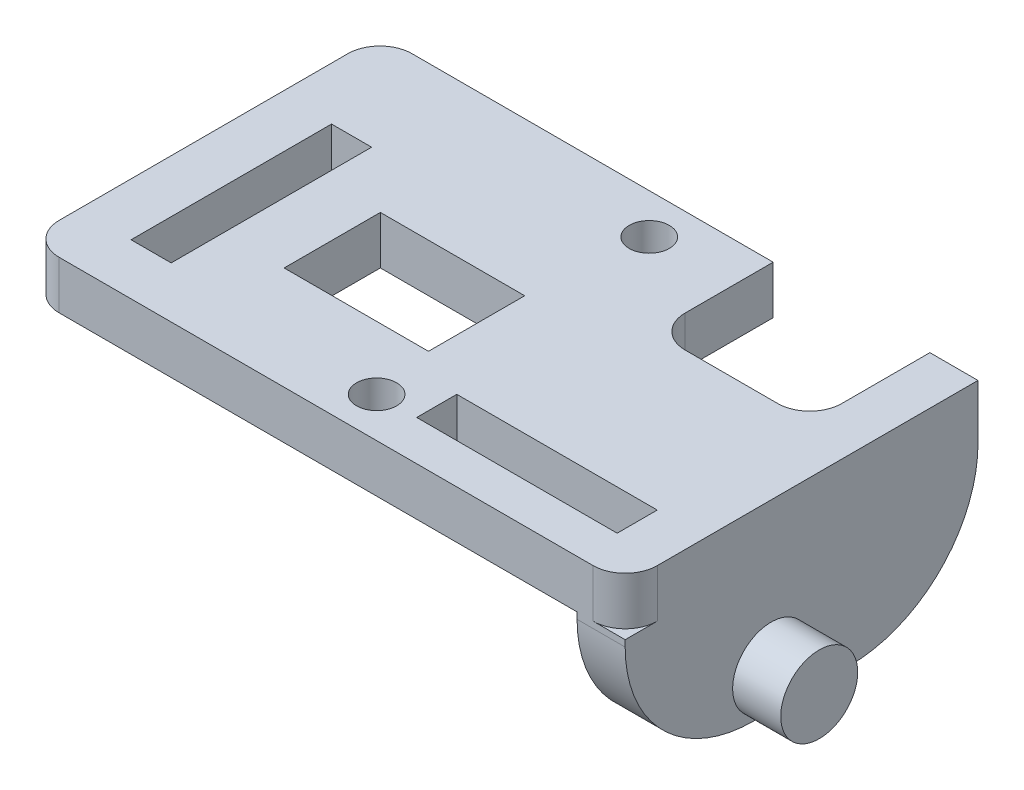
ISO-10303-21;
HEADER;
FILE_DESCRIPTION(('STEP AP214'),'2;1');
FILE_NAME('part.step','',(''),(''),'','','');
FILE_SCHEMA(('AUTOMOTIVE_DESIGN { 1 0 10303 214 1 1 1 1 }'));
ENDSEC;
DATA;
#1=APPLICATION_CONTEXT('core data for automotive mechanical design processes');
#2=APPLICATION_PROTOCOL_DEFINITION('international standard','automotive_design',2000,#1);
#3=PRODUCT_CONTEXT('',#1,'mechanical');
#4=PRODUCT('Part','Part','',(#3));
#5=PRODUCT_RELATED_PRODUCT_CATEGORY('part','',(#4));
#6=PRODUCT_DEFINITION_FORMATION('','',#4);
#7=PRODUCT_DEFINITION_CONTEXT('part definition',#1,'design');
#8=PRODUCT_DEFINITION('design','',#6,#7);
#9=PRODUCT_DEFINITION_SHAPE('','',#8);
#10=(LENGTH_UNIT() NAMED_UNIT(*) SI_UNIT(.MILLI.,.METRE.));
#11=(NAMED_UNIT(*) PLANE_ANGLE_UNIT() SI_UNIT($,.RADIAN.));
#12=(NAMED_UNIT(*) SI_UNIT($,.STERADIAN.) SOLID_ANGLE_UNIT());
#13=UNCERTAINTY_MEASURE_WITH_UNIT(LENGTH_MEASURE(1.E-05),#10,'distance_accuracy_value','');
#14=(GEOMETRIC_REPRESENTATION_CONTEXT(3) GLOBAL_UNCERTAINTY_ASSIGNED_CONTEXT((#13)) GLOBAL_UNIT_ASSIGNED_CONTEXT((#10,
#11,#12)) REPRESENTATION_CONTEXT('',''));
#15=CARTESIAN_POINT('',(0.,0.,0.));
#16=DIRECTION('',(0.,0.,1.));
#17=DIRECTION('',(1.,0.,0.));
#18=AXIS2_PLACEMENT_3D('',#15,#16,#17);
#19=CARTESIAN_POINT('',(0.,0.,0.));
#20=DIRECTION('',(0.,1.,0.));
#21=DIRECTION('',(0.,0.,1.));
#22=AXIS2_PLACEMENT_3D('',#19,#20,#21);
#23=PLANE('',#22);
#24=CARTESIAN_POINT('',(-19.2702207310731,0.,32.1300374848537));
#25=DIRECTION('',(0.,1.,0.));
#26=DIRECTION('',(0.,0.,1.));
#27=AXIS2_PLACEMENT_3D('',#24,#25,#26);
#28=CIRCLE('',#27,1.25);
#29=CARTESIAN_POINT('',(-19.2702207310731,0.,33.3800374848538));
#30=VERTEX_POINT('',#29);
#31=EDGE_CURVE('E281',#30,#30,#28,.T.);
#32=ORIENTED_EDGE('',*,*,#31,.T.);
#33=EDGE_LOOP('',(#32));
#34=FACE_BOUND('',#33,.T.);
#35=DIRECTION('',(0.,0.,-1.));
#36=VECTOR('',#35,1.);
#37=CARTESIAN_POINT('',(-19.9759075065072,0.,0.));
#38=LINE('',#37,#36);
#39=CARTESIAN_POINT('',(-19.9759075065072,0.,28.1900374848538));
#40=VERTEX_POINT('',#39);
#41=CARTESIAN_POINT('',(-19.9759075065072,0.,22.1900374848537));
#42=VERTEX_POINT('',#41);
#43=EDGE_CURVE('E652',#40,#42,#38,.T.);
#44=ORIENTED_EDGE('',*,*,#43,.T.);
#45=DIRECTION('',(1.,0.,0.));
#46=VECTOR('',#45,1.);
#47=CARTESIAN_POINT('',(0.,0.,22.1900374848537));
#48=LINE('',#47,#46);
#49=CARTESIAN_POINT('',(-28.9759075065072,0.,22.1900374848537));
#50=VERTEX_POINT('',#49);
#51=EDGE_CURVE('E643',#50,#42,#48,.T.);
#52=ORIENTED_EDGE('',*,*,#51,.F.);
#53=DIRECTION('',(0.,0.,-1.));
#54=VECTOR('',#53,1.);
#55=CARTESIAN_POINT('',(-28.9759075065072,0.,0.));
#56=LINE('',#55,#54);
#57=CARTESIAN_POINT('',(-28.9759075065072,0.,28.1900374848537));
#58=VERTEX_POINT('',#57);
#59=EDGE_CURVE('E646',#58,#50,#56,.T.);
#60=ORIENTED_EDGE('',*,*,#59,.F.);
#61=DIRECTION('',(1.,0.,0.));
#62=VECTOR('',#61,1.);
#63=CARTESIAN_POINT('',(0.,0.,28.1900374848538));
#64=LINE('',#63,#62);
#65=EDGE_CURVE('E649',#58,#40,#64,.T.);
#66=ORIENTED_EDGE('',*,*,#65,.T.);
#67=EDGE_LOOP('',(#44,#52,#60,#66));
#68=FACE_BOUND('',#67,.T.);
#69=DIRECTION('',(1.,0.,0.));
#70=VECTOR('',#69,1.);
#71=CARTESIAN_POINT('',(0.,0.,18.9400374848537));
#72=LINE('',#71,#70);
#73=CARTESIAN_POINT('',(-35.2702207310731,0.,18.9400374848537));
#74=VERTEX_POINT('',#73);
#75=CARTESIAN_POINT('',(-32.7702207310731,0.,18.9400374848537));
#76=VERTEX_POINT('',#75);
#77=EDGE_CURVE('E660',#74,#76,#72,.T.);
#78=ORIENTED_EDGE('',*,*,#77,.F.);
#79=DIRECTION('',(0.,0.,1.));
#80=VECTOR('',#79,1.);
#81=CARTESIAN_POINT('',(-35.2702207310731,0.,0.));
#82=LINE('',#81,#80);
#83=CARTESIAN_POINT('',(-35.2702207310731,0.,31.4400374848537));
#84=VERTEX_POINT('',#83);
#85=EDGE_CURVE('E655',#74,#84,#82,.T.);
#86=ORIENTED_EDGE('',*,*,#85,.T.);
#87=DIRECTION('',(1.,0.,0.));
#88=VECTOR('',#87,1.);
#89=CARTESIAN_POINT('',(0.,0.,31.4400374848537));
#90=LINE('',#89,#88);
#91=CARTESIAN_POINT('',(-32.7702207310731,0.,31.4400374848537));
#92=VERTEX_POINT('',#91);
#93=EDGE_CURVE('E617',#84,#92,#90,.T.);
#94=ORIENTED_EDGE('',*,*,#93,.T.);
#95=DIRECTION('',(0.,0.,1.));
#96=VECTOR('',#95,1.);
#97=CARTESIAN_POINT('',(-32.7702207310731,0.,0.));
#98=LINE('',#97,#96);
#99=EDGE_CURVE('E658',#76,#92,#98,.T.);
#100=ORIENTED_EDGE('',*,*,#99,.F.);
#101=EDGE_LOOP('',(#78,#86,#94,#100));
#102=FACE_BOUND('',#101,.T.);
#103=DIRECTION('',(0.,0.,-1.));
#104=VECTOR('',#103,1.);
#105=CARTESIAN_POINT('',(-4.2702207310731,0.,0.));
#106=LINE('',#105,#104);
#107=CARTESIAN_POINT('',(-4.2702207310731,0.,34.6300374848537));
#108=VERTEX_POINT('',#107);
#109=CARTESIAN_POINT('',(-4.2702207310731,0.,32.1300374848537));
#110=VERTEX_POINT('',#109);
#111=EDGE_CURVE('E258',#108,#110,#106,.T.);
#112=ORIENTED_EDGE('',*,*,#111,.F.);
#113=DIRECTION('',(1.,0.,0.));
#114=VECTOR('',#113,1.);
#115=CARTESIAN_POINT('',(0.,0.,34.6300374848537));
#116=LINE('',#115,#114);
#117=CARTESIAN_POINT('',(-36.561763485987,0.,34.6300374848537));
#118=VERTEX_POINT('',#117);
#119=EDGE_CURVE('E475',#118,#108,#116,.T.);
#120=ORIENTED_EDGE('',*,*,#119,.F.);
#121=CARTESIAN_POINT('',(-36.561763485987,0.,32.6300374848537));
#122=DIRECTION('',(0.,1.,0.));
#123=DIRECTION('',(0.,0.,1.));
#124=AXIS2_PLACEMENT_3D('',#121,#122,#123);
#125=CIRCLE('',#124,2.);
#126=CARTESIAN_POINT('',(-38.561763485987,0.,32.6300374848537));
#127=VERTEX_POINT('',#126);
#128=EDGE_CURVE('E580',#118,#127,#125,.F.);
#129=ORIENTED_EDGE('',*,*,#128,.T.);
#130=DIRECTION('',(0.,0.,1.));
#131=VECTOR('',#130,1.);
#132=CARTESIAN_POINT('',(-38.561763485987,0.,0.));
#133=LINE('',#132,#131);
#134=CARTESIAN_POINT('',(-38.561763485987,0.,14.6300374848537));
#135=VERTEX_POINT('',#134);
#136=EDGE_CURVE('E472',#135,#127,#133,.T.);
#137=ORIENTED_EDGE('',*,*,#136,.F.);
#138=CARTESIAN_POINT('',(-36.561763485987,0.,14.6300374848537));
#139=DIRECTION('',(0.,1.,0.));
#140=DIRECTION('',(0.,0.,1.));
#141=AXIS2_PLACEMENT_3D('',#138,#139,#140);
#142=CIRCLE('',#141,2.);
#143=CARTESIAN_POINT('',(-36.561763485987,0.,12.6300374848537));
#144=VERTEX_POINT('',#143);
#145=EDGE_CURVE('E582',#135,#144,#142,.F.);
#146=ORIENTED_EDGE('',*,*,#145,.T.);
#147=DIRECTION('',(1.,0.,0.));
#148=VECTOR('',#147,1.);
#149=CARTESIAN_POINT('',(0.,0.,12.6300374848537));
#150=LINE('',#149,#148);
#151=CARTESIAN_POINT('',(-14.0414444487504,0.,12.6300374848537));
#152=VERTEX_POINT('',#151);
#153=EDGE_CURVE('E470',#144,#152,#150,.T.);
#154=ORIENTED_EDGE('',*,*,#153,.T.);
#155=DIRECTION('',(0.,0.,1.));
#156=VECTOR('',#155,1.);
#157=CARTESIAN_POINT('',(-14.0414444487504,0.,0.));
#158=LINE('',#157,#156);
#159=CARTESIAN_POINT('',(-14.0414444487504,0.,18.1214427198824));
#160=VERTEX_POINT('',#159);
#161=EDGE_CURVE('E662',#152,#160,#158,.T.);
#162=ORIENTED_EDGE('',*,*,#161,.T.);
#163=CARTESIAN_POINT('',(-12.0414444487504,0.,18.1214427198824));
#164=DIRECTION('',(0.,1.,0.));
#165=DIRECTION('',(0.,0.,1.));
#166=AXIS2_PLACEMENT_3D('',#163,#164,#165);
#167=CIRCLE('',#166,2.);
#168=CARTESIAN_POINT('',(-12.0414444487504,0.,20.1214427198825));
#169=VERTEX_POINT('',#168);
#170=EDGE_CURVE('E551',#160,#169,#167,.T.);
#171=ORIENTED_EDGE('',*,*,#170,.T.);
#172=DIRECTION('',(-1.,0.,0.));
#173=VECTOR('',#172,1.);
#174=CARTESIAN_POINT('',(0.,0.,20.1214427198824));
#175=LINE('',#174,#173);
#176=CARTESIAN_POINT('',(-6.2702207310731,0.,20.1214427198824));
#177=VERTEX_POINT('',#176);
#178=EDGE_CURVE('E478',#177,#169,#175,.T.);
#179=ORIENTED_EDGE('',*,*,#178,.F.);
#180=CARTESIAN_POINT('',(-6.2702207310731,0.,18.1214427198824));
#181=DIRECTION('',(0.,1.,0.));
#182=DIRECTION('',(0.,0.,1.));
#183=AXIS2_PLACEMENT_3D('',#180,#181,#182);
#184=CIRCLE('',#183,2.);
#185=CARTESIAN_POINT('',(-4.2702207310731,0.,18.1214427198824));
#186=VERTEX_POINT('',#185);
#187=EDGE_CURVE('E492',#177,#186,#184,.T.);
#188=ORIENTED_EDGE('',*,*,#187,.T.);
#189=CARTESIAN_POINT('',(-4.2702207310731,0.,29.6300374848537));
#190=VERTEX_POINT('',#189);
#191=EDGE_CURVE('E487',#190,#186,#106,.T.);
#192=ORIENTED_EDGE('',*,*,#191,.F.);
#193=DIRECTION('',(1.,0.,0.));
#194=VECTOR('',#193,1.);
#195=CARTESIAN_POINT('',(0.,0.,29.6300374848537));
#196=LINE('',#195,#194);
#197=CARTESIAN_POINT('',(-16.7702207310731,0.,29.6300374848537));
#198=VERTEX_POINT('',#197);
#199=EDGE_CURVE('E469',#198,#190,#196,.T.);
#200=ORIENTED_EDGE('',*,*,#199,.F.);
#201=DIRECTION('',(0.,0.,-1.));
#202=VECTOR('',#201,1.);
#203=CARTESIAN_POINT('',(-16.7702207310731,0.,0.));
#204=LINE('',#203,#202);
#205=CARTESIAN_POINT('',(-16.7702207310731,0.,32.1300374848537));
#206=VERTEX_POINT('',#205);
#207=EDGE_CURVE('E467',#206,#198,#204,.T.);
#208=ORIENTED_EDGE('',*,*,#207,.F.);
#209=DIRECTION('',(1.,0.,0.));
#210=VECTOR('',#209,1.);
#211=CARTESIAN_POINT('',(0.,0.,32.1300374848537));
#212=LINE('',#211,#210);
#213=EDGE_CURVE('E241',#206,#110,#212,.T.);
#214=ORIENTED_EDGE('',*,*,#213,.T.);
#215=EDGE_LOOP('',(#112,#120,#129,#137,#146,#154,#162,#171,#179,#188,#192,#200,#208,#214));
#216=FACE_BOUND('',#215,.T.);
#217=CARTESIAN_POINT('',(-19.2702207310731,0.,15.1300374848537));
#218=DIRECTION('',(0.,1.,0.));
#219=DIRECTION('',(0.,0.,1.));
#220=AXIS2_PLACEMENT_3D('',#217,#218,#219);
#221=CIRCLE('',#220,1.25);
#222=CARTESIAN_POINT('',(-19.2702207310731,0.,16.3800374848537));
#223=VERTEX_POINT('',#222);
#224=EDGE_CURVE('E284',#223,#223,#221,.T.);
#225=ORIENTED_EDGE('',*,*,#224,.T.);
#226=EDGE_LOOP('',(#225));
#227=FACE_BOUND('',#226,.T.);
#228=ADVANCED_FACE('F35',(#34,#68,#102,#216,#227),#23,.F.);
#229=CARTESIAN_POINT('',(0.,3.,0.));
#230=DIRECTION('',(0.,1.,0.));
#231=DIRECTION('',(0.,0.,1.));
#232=AXIS2_PLACEMENT_3D('',#229,#230,#231);
#233=PLANE('',#232);
#234=CARTESIAN_POINT('',(-19.2702207310731,3.,32.1300374848537));
#235=DIRECTION('',(0.,1.,0.));
#236=DIRECTION('',(0.,0.,1.));
#237=AXIS2_PLACEMENT_3D('',#234,#235,#236);
#238=CIRCLE('',#237,1.25);
#239=CARTESIAN_POINT('',(-19.2702207310731,3.,33.3800374848538));
#240=VERTEX_POINT('',#239);
#241=EDGE_CURVE('E278',#240,#240,#238,.F.);
#242=ORIENTED_EDGE('',*,*,#241,.T.);
#243=EDGE_LOOP('',(#242));
#244=FACE_BOUND('',#243,.T.);
#245=DIRECTION('',(1.,0.,0.));
#246=VECTOR('',#245,1.);
#247=CARTESIAN_POINT('',(0.,3.,32.1300374848537));
#248=LINE('',#247,#246);
#249=CARTESIAN_POINT('',(-16.7702207310731,3.,32.1300374848537));
#250=VERTEX_POINT('',#249);
#251=CARTESIAN_POINT('',(-4.2702207310731,3.,32.1300374848537));
#252=VERTEX_POINT('',#251);
#253=EDGE_CURVE('E432',#250,#252,#248,.T.);
#254=ORIENTED_EDGE('',*,*,#253,.F.);
#255=DIRECTION('',(0.,0.,-1.));
#256=VECTOR('',#255,1.);
#257=CARTESIAN_POINT('',(-16.7702207310731,3.,0.));
#258=LINE('',#257,#256);
#259=CARTESIAN_POINT('',(-16.7702207310731,3.,29.6300374848537));
#260=VERTEX_POINT('',#259);
#261=EDGE_CURVE('E690',#250,#260,#258,.T.);
#262=ORIENTED_EDGE('',*,*,#261,.T.);
#263=DIRECTION('',(1.,0.,0.));
#264=VECTOR('',#263,1.);
#265=CARTESIAN_POINT('',(0.,3.,29.6300374848537));
#266=LINE('',#265,#264);
#267=CARTESIAN_POINT('',(-4.2702207310731,3.,29.6300374848537));
#268=VERTEX_POINT('',#267);
#269=EDGE_CURVE('E686',#260,#268,#266,.T.);
#270=ORIENTED_EDGE('',*,*,#269,.T.);
#271=DIRECTION('',(0.,0.,-1.));
#272=VECTOR('',#271,1.);
#273=CARTESIAN_POINT('',(-4.2702207310731,3.,0.));
#274=LINE('',#273,#272);
#275=EDGE_CURVE('E671',#252,#268,#274,.T.);
#276=ORIENTED_EDGE('',*,*,#275,.F.);
#277=EDGE_LOOP('',(#254,#262,#270,#276));
#278=FACE_BOUND('',#277,.T.);
#279=DIRECTION('',(1.,0.,0.));
#280=VECTOR('',#279,1.);
#281=CARTESIAN_POINT('',(0.,3.,12.6300374848537));
#282=LINE('',#281,#280);
#283=CARTESIAN_POINT('',(-36.561763485987,3.,12.6300374848537));
#284=VERTEX_POINT('',#283);
#285=CARTESIAN_POINT('',(-14.0414444487504,3.,12.6300374848537));
#286=VERTEX_POINT('',#285);
#287=EDGE_CURVE('E436',#284,#286,#282,.T.);
#288=ORIENTED_EDGE('',*,*,#287,.F.);
#289=CARTESIAN_POINT('',(-36.561763485987,3.,14.6300374848537));
#290=DIRECTION('',(0.,1.,0.));
#291=DIRECTION('',(0.,0.,1.));
#292=AXIS2_PLACEMENT_3D('',#289,#290,#291);
#293=CIRCLE('',#292,2.);
#294=CARTESIAN_POINT('',(-38.561763485987,3.,14.6300374848537));
#295=VERTEX_POINT('',#294);
#296=EDGE_CURVE('E538',#284,#295,#293,.T.);
#297=ORIENTED_EDGE('',*,*,#296,.T.);
#298=DIRECTION('',(0.,0.,1.));
#299=VECTOR('',#298,1.);
#300=CARTESIAN_POINT('',(-38.561763485987,3.,0.));
#301=LINE('',#300,#299);
#302=CARTESIAN_POINT('',(-38.561763485987,3.,32.6300374848537));
#303=VERTEX_POINT('',#302);
#304=EDGE_CURVE('E596',#295,#303,#301,.T.);
#305=ORIENTED_EDGE('',*,*,#304,.T.);
#306=CARTESIAN_POINT('',(-36.561763485987,3.,32.6300374848537));
#307=DIRECTION('',(0.,1.,0.));
#308=DIRECTION('',(0.,0.,1.));
#309=AXIS2_PLACEMENT_3D('',#306,#307,#308);
#310=CIRCLE('',#309,2.);
#311=CARTESIAN_POINT('',(-36.561763485987,3.,34.6300374848537));
#312=VERTEX_POINT('',#311);
#313=EDGE_CURVE('E543',#303,#312,#310,.T.);
#314=ORIENTED_EDGE('',*,*,#313,.T.);
#315=DIRECTION('',(1.,0.,0.));
#316=VECTOR('',#315,1.);
#317=CARTESIAN_POINT('',(0.,3.,34.6300374848537));
#318=LINE('',#317,#316);
#319=CARTESIAN_POINT('',(-3.2702207310731,3.,34.6300374848537));
#320=VERTEX_POINT('',#319);
#321=EDGE_CURVE('E590',#312,#320,#318,.T.);
#322=ORIENTED_EDGE('',*,*,#321,.T.);
#323=CARTESIAN_POINT('',(-3.2702207310731,3.,32.6300374848537));
#324=DIRECTION('',(0.,1.,0.));
#325=DIRECTION('',(0.,0.,1.));
#326=AXIS2_PLACEMENT_3D('',#323,#324,#325);
#327=CIRCLE('',#326,2.);
#328=CARTESIAN_POINT('',(-1.2702207310731,3.,32.6300374848537));
#329=VERTEX_POINT('',#328);
#330=EDGE_CURVE('E547',#320,#329,#327,.T.);
#331=ORIENTED_EDGE('',*,*,#330,.T.);
#332=DIRECTION('',(0.,0.,1.));
#333=VECTOR('',#332,1.);
#334=CARTESIAN_POINT('',(-1.2702207310731,3.,0.));
#335=LINE('',#334,#333);
#336=CARTESIAN_POINT('',(-1.2702207310731,3.,12.6300374848537));
#337=VERTEX_POINT('',#336);
#338=EDGE_CURVE('E588',#337,#329,#335,.T.);
#339=ORIENTED_EDGE('',*,*,#338,.F.);
#340=DIRECTION('',(1.,0.,0.));
#341=VECTOR('',#340,1.);
#342=CARTESIAN_POINT('',(0.,3.,12.6300374848537));
#343=LINE('',#342,#341);
#344=CARTESIAN_POINT('',(-4.2702207310731,3.,12.6300374848537));
#345=VERTEX_POINT('',#344);
#346=EDGE_CURVE('E592',#345,#337,#343,.T.);
#347=ORIENTED_EDGE('',*,*,#346,.F.);
#348=DIRECTION('',(0.,0.,-1.));
#349=VECTOR('',#348,1.);
#350=CARTESIAN_POINT('',(-4.2702207310731,3.,0.));
#351=LINE('',#350,#349);
#352=CARTESIAN_POINT('',(-4.2702207310731,3.,18.1214427198824));
#353=VERTEX_POINT('',#352);
#354=EDGE_CURVE('E594',#353,#345,#351,.T.);
#355=ORIENTED_EDGE('',*,*,#354,.F.);
#356=CARTESIAN_POINT('',(-6.2702207310731,3.,18.1214427198824));
#357=DIRECTION('',(0.,1.,0.));
#358=DIRECTION('',(0.,0.,1.));
#359=AXIS2_PLACEMENT_3D('',#356,#357,#358);
#360=CIRCLE('',#359,2.);
#361=CARTESIAN_POINT('',(-6.2702207310731,3.,20.1214427198824));
#362=VERTEX_POINT('',#361);
#363=EDGE_CURVE('E494',#353,#362,#360,.F.);
#364=ORIENTED_EDGE('',*,*,#363,.T.);
#365=DIRECTION('',(-1.,0.,0.));
#366=VECTOR('',#365,1.);
#367=CARTESIAN_POINT('',(0.,3.,20.1214427198824));
#368=LINE('',#367,#366);
#369=CARTESIAN_POINT('',(-12.0414444487504,3.,20.1214427198825));
#370=VERTEX_POINT('',#369);
#371=EDGE_CURVE('E561',#362,#370,#368,.T.);
#372=ORIENTED_EDGE('',*,*,#371,.T.);
#373=CARTESIAN_POINT('',(-12.0414444487504,3.,18.1214427198824));
#374=DIRECTION('',(0.,1.,0.));
#375=DIRECTION('',(0.,0.,1.));
#376=AXIS2_PLACEMENT_3D('',#373,#374,#375);
#377=CIRCLE('',#376,2.);
#378=CARTESIAN_POINT('',(-14.0414444487504,3.,18.1214427198824));
#379=VERTEX_POINT('',#378);
#380=EDGE_CURVE('E483',#370,#379,#377,.F.);
#381=ORIENTED_EDGE('',*,*,#380,.T.);
#382=DIRECTION('',(0.,0.,1.));
#383=VECTOR('',#382,1.);
#384=CARTESIAN_POINT('',(-14.0414444487504,3.,0.));
#385=LINE('',#384,#383);
#386=EDGE_CURVE('E559',#286,#379,#385,.T.);
#387=ORIENTED_EDGE('',*,*,#386,.F.);
#388=EDGE_LOOP('',(#288,#297,#305,#314,#322,#331,#339,#347,#355,#364,#372,#381,#387));
#389=FACE_BOUND('',#388,.T.);
#390=DIRECTION('',(1.,0.,0.));
#391=VECTOR('',#390,1.);
#392=CARTESIAN_POINT('',(0.,3.,18.9400374848537));
#393=LINE('',#392,#391);
#394=CARTESIAN_POINT('',(-35.2702207310731,3.,18.9400374848537));
#395=VERTEX_POINT('',#394);
#396=CARTESIAN_POINT('',(-32.7702207310731,3.,18.9400374848537));
#397=VERTEX_POINT('',#396);
#398=EDGE_CURVE('E442',#395,#397,#393,.T.);
#399=ORIENTED_EDGE('',*,*,#398,.T.);
#400=DIRECTION('',(0.,0.,1.));
#401=VECTOR('',#400,1.);
#402=CARTESIAN_POINT('',(-32.7702207310731,3.,0.));
#403=LINE('',#402,#401);
#404=CARTESIAN_POINT('',(-32.7702207310731,3.,31.4400374848537));
#405=VERTEX_POINT('',#404);
#406=EDGE_CURVE('E603',#397,#405,#403,.T.);
#407=ORIENTED_EDGE('',*,*,#406,.T.);
#408=DIRECTION('',(1.,0.,0.));
#409=VECTOR('',#408,1.);
#410=CARTESIAN_POINT('',(0.,3.,31.4400374848537));
#411=LINE('',#410,#409);
#412=CARTESIAN_POINT('',(-35.2702207310731,3.,31.4400374848537));
#413=VERTEX_POINT('',#412);
#414=EDGE_CURVE('E605',#413,#405,#411,.T.);
#415=ORIENTED_EDGE('',*,*,#414,.F.);
#416=DIRECTION('',(0.,0.,1.));
#417=VECTOR('',#416,1.);
#418=CARTESIAN_POINT('',(-35.2702207310731,3.,0.));
#419=LINE('',#418,#417);
#420=EDGE_CURVE('E453',#395,#413,#419,.T.);
#421=ORIENTED_EDGE('',*,*,#420,.F.);
#422=EDGE_LOOP('',(#399,#407,#415,#421));
#423=FACE_BOUND('',#422,.T.);
#424=DIRECTION('',(0.,0.,-1.));
#425=VECTOR('',#424,1.);
#426=CARTESIAN_POINT('',(-19.9759075065072,3.,0.));
#427=LINE('',#426,#425);
#428=CARTESIAN_POINT('',(-19.9759075065072,3.,28.1900374848538));
#429=VERTEX_POINT('',#428);
#430=CARTESIAN_POINT('',(-19.9759075065072,3.,22.1900374848537));
#431=VERTEX_POINT('',#430);
#432=EDGE_CURVE('E447',#429,#431,#427,.T.);
#433=ORIENTED_EDGE('',*,*,#432,.F.);
#434=DIRECTION('',(1.,0.,0.));
#435=VECTOR('',#434,1.);
#436=CARTESIAN_POINT('',(0.,3.,28.1900374848538));
#437=LINE('',#436,#435);
#438=CARTESIAN_POINT('',(-28.9759075065072,3.,28.1900374848537));
#439=VERTEX_POINT('',#438);
#440=EDGE_CURVE('E450',#439,#429,#437,.T.);
#441=ORIENTED_EDGE('',*,*,#440,.F.);
#442=DIRECTION('',(0.,0.,-1.));
#443=VECTOR('',#442,1.);
#444=CARTESIAN_POINT('',(-28.9759075065072,3.,0.));
#445=LINE('',#444,#443);
#446=CARTESIAN_POINT('',(-28.9759075065072,3.,22.1900374848537));
#447=VERTEX_POINT('',#446);
#448=EDGE_CURVE('E460',#439,#447,#445,.T.);
#449=ORIENTED_EDGE('',*,*,#448,.T.);
#450=DIRECTION('',(1.,0.,0.));
#451=VECTOR('',#450,1.);
#452=CARTESIAN_POINT('',(0.,3.,22.1900374848537));
#453=LINE('',#452,#451);
#454=EDGE_CURVE('E451',#447,#431,#453,.T.);
#455=ORIENTED_EDGE('',*,*,#454,.T.);
#456=EDGE_LOOP('',(#433,#441,#449,#455));
#457=FACE_BOUND('',#456,.T.);
#458=CARTESIAN_POINT('',(-19.2702207310731,3.,15.1300374848537));
#459=DIRECTION('',(0.,1.,0.));
#460=DIRECTION('',(0.,0.,1.));
#461=AXIS2_PLACEMENT_3D('',#458,#459,#460);
#462=CIRCLE('',#461,1.25);
#463=CARTESIAN_POINT('',(-19.2702207310731,3.,16.3800374848537));
#464=VERTEX_POINT('',#463);
#465=EDGE_CURVE('E39',#464,#464,#462,.F.);
#466=ORIENTED_EDGE('',*,*,#465,.T.);
#467=EDGE_LOOP('',(#466));
#468=FACE_BOUND('',#467,.T.);
#469=ADVANCED_FACE('F291',(#244,#278,#389,#423,#457,#468),#233,.T.);
#470=CARTESIAN_POINT('',(-1.2702207310731,3.,0.));
#471=DIRECTION('',(1.,0.,0.));
#472=DIRECTION('',(0.,0.,-1.));
#473=AXIS2_PLACEMENT_3D('',#470,#471,#472);
#474=PLANE('',#473);
#475=DIRECTION('',(0.,0.,1.));
#476=VECTOR('',#475,1.);
#477=CARTESIAN_POINT('',(-1.2702207310731,-8.4,0.));
#478=LINE('',#477,#476);
#479=CARTESIAN_POINT('',(-1.2702207310731,-8.4,20.6300374848537));
#480=VERTEX_POINT('',#479);
#481=CARTESIAN_POINT('',(-1.2702207310731,-8.4,25.5300374848537));
#482=VERTEX_POINT('',#481);
#483=EDGE_CURVE('E269',#480,#482,#478,.T.);
#484=ORIENTED_EDGE('',*,*,#483,.F.);
#485=CARTESIAN_POINT('',(-1.2702207310731,-0.400000000000001,20.6300374848537));
#486=DIRECTION('',(1.,0.,0.));
#487=DIRECTION('',(0.,0.,-1.));
#488=AXIS2_PLACEMENT_3D('',#485,#486,#487);
#489=CIRCLE('',#488,8.);
#490=CARTESIAN_POINT('',(-1.2702207310731,-0.400000000000001,12.6300374848537));
#491=VERTEX_POINT('',#490);
#492=EDGE_CURVE('E526',#480,#491,#489,.T.);
#493=ORIENTED_EDGE('',*,*,#492,.T.);
#494=DIRECTION('',(0.,-1.,0.));
#495=VECTOR('',#494,1.);
#496=CARTESIAN_POINT('',(-1.2702207310731,3.,12.6300374848537));
#497=LINE('',#496,#495);
#498=EDGE_CURVE('E591',#337,#491,#497,.T.);
#499=ORIENTED_EDGE('',*,*,#498,.F.);
#500=ORIENTED_EDGE('',*,*,#338,.T.);
#501=DIRECTION('',(0.,-1.,0.));
#502=VECTOR('',#501,1.);
#503=CARTESIAN_POINT('',(-1.2702207310731,0.,32.6300374848537));
#504=LINE('',#503,#502);
#505=CARTESIAN_POINT('',(-1.2702207310731,0.,32.6300374848537));
#506=VERTEX_POINT('',#505);
#507=EDGE_CURVE('E251',#329,#506,#504,.T.);
#508=ORIENTED_EDGE('',*,*,#507,.T.);
#509=DIRECTION('',(0.,0.,1.));
#510=VECTOR('',#509,1.);
#511=CARTESIAN_POINT('',(-1.2702207310731,0.,0.));
#512=LINE('',#511,#510);
#513=CARTESIAN_POINT('',(-1.2702207310731,0.,34.6300374848537));
#514=VERTEX_POINT('',#513);
#515=EDGE_CURVE('E246',#506,#514,#512,.T.);
#516=ORIENTED_EDGE('',*,*,#515,.T.);
#517=DIRECTION('',(0.,1.,0.));
#518=VECTOR('',#517,1.);
#519=CARTESIAN_POINT('',(-1.2702207310731,-8.4,34.6300374848537));
#520=LINE('',#519,#518);
#521=CARTESIAN_POINT('',(-1.2702207310731,-0.400000000000001,34.6300374848537));
#522=VERTEX_POINT('',#521);
#523=EDGE_CURVE('E234',#522,#514,#520,.T.);
#524=ORIENTED_EDGE('',*,*,#523,.F.);
#525=CARTESIAN_POINT('',(-1.2702207310731,-0.400000000000001,26.6300374848537));
#526=DIRECTION('',(1.,0.,0.));
#527=DIRECTION('',(0.,0.,-1.));
#528=AXIS2_PLACEMENT_3D('',#525,#526,#527);
#529=CIRCLE('',#528,8.);
#530=CARTESIAN_POINT('',(-1.2702207310731,-8.4,26.6300374848537));
#531=VERTEX_POINT('',#530);
#532=EDGE_CURVE('E528',#522,#531,#529,.T.);
#533=ORIENTED_EDGE('',*,*,#532,.T.);
#534=EDGE_CURVE('E272',#482,#531,#478,.T.);
#535=ORIENTED_EDGE('',*,*,#534,.F.);
#536=CARTESIAN_POINT('',(-1.2702207310731,-6.,25.5300374848537));
#537=DIRECTION('',(1.,0.,0.));
#538=DIRECTION('',(0.,0.,-1.));
#539=AXIS2_PLACEMENT_3D('',#536,#537,#538);
#540=CIRCLE('',#539,2.4);
#541=EDGE_CURVE('E275',#482,#482,#540,.T.);
#542=ORIENTED_EDGE('',*,*,#541,.F.);
#543=EDGE_LOOP('',(#484,#493,#499,#500,#508,#516,#524,#533,#535,#542));
#544=FACE_BOUND('',#543,.T.);
#545=ADVANCED_FACE('F248',(#544),#474,.T.);
#546=CARTESIAN_POINT('',(-19.9759075065072,3.,0.));
#547=DIRECTION('',(-1.,0.,0.));
#548=DIRECTION('',(0.,0.,1.));
#549=AXIS2_PLACEMENT_3D('',#546,#547,#548);
#550=PLANE('',#549);
#551=ORIENTED_EDGE('',*,*,#43,.F.);
#552=DIRECTION('',(0.,-1.,0.));
#553=VECTOR('',#552,1.);
#554=CARTESIAN_POINT('',(-19.9759075065072,3.,28.1900374848538));
#555=LINE('',#554,#553);
#556=EDGE_CURVE('E456',#429,#40,#555,.T.);
#557=ORIENTED_EDGE('',*,*,#556,.F.);
#558=ORIENTED_EDGE('',*,*,#432,.T.);
#559=DIRECTION('',(0.,-1.,0.));
#560=VECTOR('',#559,1.);
#561=CARTESIAN_POINT('',(-19.9759075065072,3.,22.1900374848537));
#562=LINE('',#561,#560);
#563=EDGE_CURVE('E627',#431,#42,#562,.T.);
#564=ORIENTED_EDGE('',*,*,#563,.T.);
#565=EDGE_LOOP('',(#551,#557,#558,#564));
#566=FACE_BOUND('',#565,.T.);
#567=ADVANCED_FACE('F328',(#566),#550,.T.);
#568=CARTESIAN_POINT('',(0.,3.,28.1900374848538));
#569=DIRECTION('',(0.,0.,-1.));
#570=DIRECTION('',(-1.,0.,0.));
#571=AXIS2_PLACEMENT_3D('',#568,#569,#570);
#572=PLANE('',#571);
#573=ORIENTED_EDGE('',*,*,#65,.F.);
#574=DIRECTION('',(0.,-1.,0.));
#575=VECTOR('',#574,1.);
#576=CARTESIAN_POINT('',(-28.9759075065072,3.,28.1900374848537));
#577=LINE('',#576,#575);
#578=EDGE_CURVE('E458',#439,#58,#577,.T.);
#579=ORIENTED_EDGE('',*,*,#578,.F.);
#580=ORIENTED_EDGE('',*,*,#440,.T.);
#581=ORIENTED_EDGE('',*,*,#556,.T.);
#582=EDGE_LOOP('',(#573,#579,#580,#581));
#583=FACE_BOUND('',#582,.T.);
#584=ADVANCED_FACE('F324',(#583),#572,.T.);
#585=CARTESIAN_POINT('',(-28.9759075065072,3.,0.));
#586=DIRECTION('',(-1.,0.,0.));
#587=DIRECTION('',(0.,0.,1.));
#588=AXIS2_PLACEMENT_3D('',#585,#586,#587);
#589=PLANE('',#588);
#590=ORIENTED_EDGE('',*,*,#59,.T.);
#591=DIRECTION('',(0.,-1.,0.));
#592=VECTOR('',#591,1.);
#593=CARTESIAN_POINT('',(-28.9759075065072,3.,22.1900374848537));
#594=LINE('',#593,#592);
#595=EDGE_CURVE('E637',#447,#50,#594,.T.);
#596=ORIENTED_EDGE('',*,*,#595,.F.);
#597=ORIENTED_EDGE('',*,*,#448,.F.);
#598=ORIENTED_EDGE('',*,*,#578,.T.);
#599=EDGE_LOOP('',(#590,#596,#597,#598));
#600=FACE_BOUND('',#599,.T.);
#601=ADVANCED_FACE('F320',(#600),#589,.F.);
#602=CARTESIAN_POINT('',(0.,3.,18.9400374848537));
#603=DIRECTION('',(0.,0.,-1.));
#604=DIRECTION('',(-1.,0.,0.));
#605=AXIS2_PLACEMENT_3D('',#602,#603,#604);
#606=PLANE('',#605);
#607=ORIENTED_EDGE('',*,*,#77,.T.);
#608=DIRECTION('',(0.,-1.,0.));
#609=VECTOR('',#608,1.);
#610=CARTESIAN_POINT('',(-32.7702207310731,3.,18.9400374848537));
#611=LINE('',#610,#609);
#612=EDGE_CURVE('E620',#397,#76,#611,.T.);
#613=ORIENTED_EDGE('',*,*,#612,.F.);
#614=ORIENTED_EDGE('',*,*,#398,.F.);
#615=DIRECTION('',(0.,-1.,0.));
#616=VECTOR('',#615,1.);
#617=CARTESIAN_POINT('',(-35.2702207310731,3.,18.9400374848537));
#618=LINE('',#617,#616);
#619=EDGE_CURVE('E611',#395,#74,#618,.T.);
#620=ORIENTED_EDGE('',*,*,#619,.T.);
#621=EDGE_LOOP('',(#607,#613,#614,#620));
#622=FACE_BOUND('',#621,.T.);
#623=ADVANCED_FACE('F323',(#622),#606,.F.);
#624=CARTESIAN_POINT('',(-32.7702207310731,3.,0.));
#625=DIRECTION('',(1.,0.,0.));
#626=DIRECTION('',(0.,0.,-1.));
#627=AXIS2_PLACEMENT_3D('',#624,#625,#626);
#628=PLANE('',#627);
#629=ORIENTED_EDGE('',*,*,#99,.T.);
#630=DIRECTION('',(0.,-1.,0.));
#631=VECTOR('',#630,1.);
#632=CARTESIAN_POINT('',(-32.7702207310731,3.,31.4400374848537));
#633=LINE('',#632,#631);
#634=EDGE_CURVE('E614',#405,#92,#633,.T.);
#635=ORIENTED_EDGE('',*,*,#634,.F.);
#636=ORIENTED_EDGE('',*,*,#406,.F.);
#637=ORIENTED_EDGE('',*,*,#612,.T.);
#638=EDGE_LOOP('',(#629,#635,#636,#637));
#639=FACE_BOUND('',#638,.T.);
#640=ADVANCED_FACE('F342',(#639),#628,.F.);
#641=CARTESIAN_POINT('',(0.,3.,31.4400374848537));
#642=DIRECTION('',(0.,0.,-1.));
#643=DIRECTION('',(-1.,0.,0.));
#644=AXIS2_PLACEMENT_3D('',#641,#642,#643);
#645=PLANE('',#644);
#646=ORIENTED_EDGE('',*,*,#93,.F.);
#647=DIRECTION('',(0.,-1.,0.));
#648=VECTOR('',#647,1.);
#649=CARTESIAN_POINT('',(-35.2702207310731,3.,31.4400374848537));
#650=LINE('',#649,#648);
#651=EDGE_CURVE('E609',#413,#84,#650,.T.);
#652=ORIENTED_EDGE('',*,*,#651,.F.);
#653=ORIENTED_EDGE('',*,*,#414,.T.);
#654=ORIENTED_EDGE('',*,*,#634,.T.);
#655=EDGE_LOOP('',(#646,#652,#653,#654));
#656=FACE_BOUND('',#655,.T.);
#657=ADVANCED_FACE('F338',(#656),#645,.T.);
#658=CARTESIAN_POINT('',(0.,3.,12.6300374848537));
#659=DIRECTION('',(0.,0.,-1.));
#660=DIRECTION('',(-1.,0.,0.));
#661=AXIS2_PLACEMENT_3D('',#658,#659,#660);
#662=PLANE('',#661);
#663=ORIENTED_EDGE('',*,*,#153,.F.);
#664=DIRECTION('',(0.,-1.,0.));
#665=VECTOR('',#664,1.);
#666=CARTESIAN_POINT('',(-36.561763485987,3.,12.6300374848537));
#667=LINE('',#666,#665);
#668=EDGE_CURVE('E584',#144,#284,#667,.F.);
#669=ORIENTED_EDGE('',*,*,#668,.T.);
#670=ORIENTED_EDGE('',*,*,#287,.T.);
#671=DIRECTION('',(0.,-1.,0.));
#672=VECTOR('',#671,1.);
#673=CARTESIAN_POINT('',(-14.0414444487504,3.,12.6300374848537));
#674=LINE('',#673,#672);
#675=EDGE_CURVE('E568',#286,#152,#674,.T.);
#676=ORIENTED_EDGE('',*,*,#675,.T.);
#677=EDGE_LOOP('',(#663,#669,#670,#676));
#678=FACE_BOUND('',#677,.T.);
#679=ADVANCED_FACE('F341',(#678),#662,.T.);
#680=CARTESIAN_POINT('',(-38.561763485987,3.,0.));
#681=DIRECTION('',(1.,0.,0.));
#682=DIRECTION('',(0.,0.,-1.));
#683=AXIS2_PLACEMENT_3D('',#680,#681,#682);
#684=PLANE('',#683);
#685=ORIENTED_EDGE('',*,*,#304,.F.);
#686=DIRECTION('',(0.,-1.,0.));
#687=VECTOR('',#686,1.);
#688=CARTESIAN_POINT('',(-38.561763485987,0.,14.6300374848537));
#689=LINE('',#688,#687);
#690=EDGE_CURVE('E572',#295,#135,#689,.T.);
#691=ORIENTED_EDGE('',*,*,#690,.T.);
#692=ORIENTED_EDGE('',*,*,#136,.T.);
#693=DIRECTION('',(0.,-1.,0.));
#694=VECTOR('',#693,1.);
#695=CARTESIAN_POINT('',(-38.561763485987,3.,32.6300374848537));
#696=LINE('',#695,#694);
#697=EDGE_CURVE('E570',#127,#303,#696,.F.);
#698=ORIENTED_EDGE('',*,*,#697,.T.);
#699=EDGE_LOOP('',(#685,#691,#692,#698));
#700=FACE_BOUND('',#699,.T.);
#701=ADVANCED_FACE('F368',(#700),#684,.F.);
#702=CARTESIAN_POINT('',(0.,3.,34.6300374848537));
#703=DIRECTION('',(0.,0.,-1.));
#704=DIRECTION('',(-1.,0.,0.));
#705=AXIS2_PLACEMENT_3D('',#702,#703,#704);
#706=PLANE('',#705);
#707=DIRECTION('',(0.,1.,0.));
#708=VECTOR('',#707,1.);
#709=CARTESIAN_POINT('',(-4.2702207310731,-8.4,34.6300374848537));
#710=LINE('',#709,#708);
#711=CARTESIAN_POINT('',(-4.2702207310731,-0.400000000000001,34.6300374848537));
#712=VERTEX_POINT('',#711);
#713=EDGE_CURVE('E242',#712,#108,#710,.T.);
#714=ORIENTED_EDGE('',*,*,#713,.F.);
#715=DIRECTION('',(1.,0.,0.));
#716=VECTOR('',#715,1.);
#717=CARTESIAN_POINT('',(0.,-0.400000000000001,34.6300374848537));
#718=LINE('',#717,#716);
#719=EDGE_CURVE('E12',#712,#522,#718,.T.);
#720=ORIENTED_EDGE('',*,*,#719,.T.);
#721=ORIENTED_EDGE('',*,*,#523,.T.);
#722=DIRECTION('',(1.,0.,0.));
#723=VECTOR('',#722,1.);
#724=CARTESIAN_POINT('',(0.,0.,34.6300374848537));
#725=LINE('',#724,#723);
#726=CARTESIAN_POINT('',(-3.2702207310731,0.,34.6300374848537));
#727=VERTEX_POINT('',#726);
#728=EDGE_CURVE('E238',#727,#514,#725,.T.);
#729=ORIENTED_EDGE('',*,*,#728,.F.);
#730=DIRECTION('',(0.,-1.,0.));
#731=VECTOR('',#730,1.);
#732=CARTESIAN_POINT('',(-3.2702207310731,3.,34.6300374848537));
#733=LINE('',#732,#731);
#734=EDGE_CURVE('E537',#727,#320,#733,.F.);
#735=ORIENTED_EDGE('',*,*,#734,.T.);
#736=ORIENTED_EDGE('',*,*,#321,.F.);
#737=DIRECTION('',(0.,-1.,0.));
#738=VECTOR('',#737,1.);
#739=CARTESIAN_POINT('',(-36.561763485987,3.,34.6300374848537));
#740=LINE('',#739,#738);
#741=EDGE_CURVE('E535',#312,#118,#740,.T.);
#742=ORIENTED_EDGE('',*,*,#741,.T.);
#743=ORIENTED_EDGE('',*,*,#119,.T.);
#744=EDGE_LOOP('',(#714,#720,#721,#729,#735,#736,#742,#743));
#745=FACE_BOUND('',#744,.T.);
#746=ADVANCED_FACE('F236',(#745),#706,.F.);
#747=CARTESIAN_POINT('',(0.,3.,12.6300374848537));
#748=DIRECTION('',(0.,0.,-1.));
#749=DIRECTION('',(-1.,0.,0.));
#750=AXIS2_PLACEMENT_3D('',#747,#748,#749);
#751=PLANE('',#750);
#752=ORIENTED_EDGE('',*,*,#498,.T.);
#753=DIRECTION('',(1.,0.,0.));
#754=VECTOR('',#753,1.);
#755=CARTESIAN_POINT('',(-4.2702207310731,-0.400000000000001,12.6300374848537));
#756=LINE('',#755,#754);
#757=CARTESIAN_POINT('',(-4.2702207310731,-0.400000000000001,12.6300374848537));
#758=VERTEX_POINT('',#757);
#759=EDGE_CURVE('E60',#491,#758,#756,.F.);
#760=ORIENTED_EDGE('',*,*,#759,.T.);
#761=DIRECTION('',(0.,-1.,0.));
#762=VECTOR('',#761,1.);
#763=CARTESIAN_POINT('',(-4.2702207310731,3.,12.6300374848537));
#764=LINE('',#763,#762);
#765=EDGE_CURVE('E629',#345,#758,#764,.T.);
#766=ORIENTED_EDGE('',*,*,#765,.F.);
#767=ORIENTED_EDGE('',*,*,#346,.T.);
#768=EDGE_LOOP('',(#752,#760,#766,#767));
#769=FACE_BOUND('',#768,.T.);
#770=ADVANCED_FACE('F361',(#769),#751,.T.);
#771=CARTESIAN_POINT('',(-4.2702207310731,3.,0.));
#772=DIRECTION('',(-1.,0.,0.));
#773=DIRECTION('',(0.,0.,1.));
#774=AXIS2_PLACEMENT_3D('',#771,#772,#773);
#775=PLANE('',#774);
#776=ORIENTED_EDGE('',*,*,#765,.T.);
#777=CARTESIAN_POINT('',(-4.2702207310731,-0.400000000000001,20.6300374848537));
#778=DIRECTION('',(-1.,0.,0.));
#779=DIRECTION('',(0.,0.,1.));
#780=AXIS2_PLACEMENT_3D('',#777,#778,#779);
#781=CIRCLE('',#780,8.);
#782=CARTESIAN_POINT('',(-4.2702207310731,-8.4,20.6300374848537));
#783=VERTEX_POINT('',#782);
#784=EDGE_CURVE('E44',#758,#783,#781,.T.);
#785=ORIENTED_EDGE('',*,*,#784,.T.);
#786=DIRECTION('',(0.,0.,-1.));
#787=VECTOR('',#786,1.);
#788=CARTESIAN_POINT('',(-4.2702207310731,-8.4,0.));
#789=LINE('',#788,#787);
#790=CARTESIAN_POINT('',(-4.2702207310731,-8.4,26.6300374848537));
#791=VERTEX_POINT('',#790);
#792=EDGE_CURVE('E254',#791,#783,#789,.T.);
#793=ORIENTED_EDGE('',*,*,#792,.F.);
#794=CARTESIAN_POINT('',(-4.2702207310731,-0.400000000000001,26.6300374848537));
#795=DIRECTION('',(-1.,0.,0.));
#796=DIRECTION('',(0.,0.,1.));
#797=AXIS2_PLACEMENT_3D('',#794,#795,#796);
#798=CIRCLE('',#797,8.);
#799=EDGE_CURVE('E52',#791,#712,#798,.T.);
#800=ORIENTED_EDGE('',*,*,#799,.T.);
#801=ORIENTED_EDGE('',*,*,#713,.T.);
#802=ORIENTED_EDGE('',*,*,#111,.T.);
#803=DIRECTION('',(0.,-1.,0.));
#804=VECTOR('',#803,1.);
#805=CARTESIAN_POINT('',(-4.2702207310731,3.,32.1300374848537));
#806=LINE('',#805,#804);
#807=EDGE_CURVE('E466',#252,#110,#806,.T.);
#808=ORIENTED_EDGE('',*,*,#807,.F.);
#809=ORIENTED_EDGE('',*,*,#275,.T.);
#810=DIRECTION('',(0.,-1.,0.));
#811=VECTOR('',#810,1.);
#812=CARTESIAN_POINT('',(-4.2702207310731,3.,29.6300374848537));
#813=LINE('',#812,#811);
#814=EDGE_CURVE('E503',#268,#190,#813,.T.);
#815=ORIENTED_EDGE('',*,*,#814,.T.);
#816=ORIENTED_EDGE('',*,*,#191,.T.);
#817=DIRECTION('',(0.,-1.,0.));
#818=VECTOR('',#817,1.);
#819=CARTESIAN_POINT('',(-4.2702207310731,3.,18.1214427198824));
#820=LINE('',#819,#818);
#821=EDGE_CURVE('E497',#186,#353,#820,.F.);
#822=ORIENTED_EDGE('',*,*,#821,.T.);
#823=ORIENTED_EDGE('',*,*,#354,.T.);
#824=EDGE_LOOP('',(#776,#785,#793,#800,#801,#802,#808,#809,#815,#816,#822,#823));
#825=FACE_BOUND('',#824,.T.);
#826=ADVANCED_FACE('F357',(#825),#775,.T.);
#827=CARTESIAN_POINT('',(0.,3.,20.1214427198824));
#828=DIRECTION('',(0.,0.,1.));
#829=DIRECTION('',(1.,0.,0.));
#830=AXIS2_PLACEMENT_3D('',#827,#828,#829);
#831=PLANE('',#830);
#832=ORIENTED_EDGE('',*,*,#371,.F.);
#833=DIRECTION('',(0.,-1.,0.));
#834=VECTOR('',#833,1.);
#835=CARTESIAN_POINT('',(-6.2702207310731,3.,20.1214427198824));
#836=LINE('',#835,#834);
#837=EDGE_CURVE('E500',#362,#177,#836,.T.);
#838=ORIENTED_EDGE('',*,*,#837,.T.);
#839=ORIENTED_EDGE('',*,*,#178,.T.);
#840=DIRECTION('',(0.,-1.,0.));
#841=VECTOR('',#840,1.);
#842=CARTESIAN_POINT('',(-12.0414444487504,3.,20.1214427198825));
#843=LINE('',#842,#841);
#844=EDGE_CURVE('E635',#169,#370,#843,.F.);
#845=ORIENTED_EDGE('',*,*,#844,.T.);
#846=EDGE_LOOP('',(#832,#838,#839,#845));
#847=FACE_BOUND('',#846,.T.);
#848=ADVANCED_FACE('F353',(#847),#831,.F.);
#849=CARTESIAN_POINT('',(0.,3.,32.1300374848537));
#850=DIRECTION('',(0.,0.,-1.));
#851=DIRECTION('',(-1.,0.,0.));
#852=AXIS2_PLACEMENT_3D('',#849,#850,#851);
#853=PLANE('',#852);
#854=ORIENTED_EDGE('',*,*,#213,.F.);
#855=DIRECTION('',(0.,-1.,0.));
#856=VECTOR('',#855,1.);
#857=CARTESIAN_POINT('',(-16.7702207310731,3.,32.1300374848537));
#858=LINE('',#857,#856);
#859=EDGE_CURVE('E630',#250,#206,#858,.T.);
#860=ORIENTED_EDGE('',*,*,#859,.F.);
#861=ORIENTED_EDGE('',*,*,#253,.T.);
#862=ORIENTED_EDGE('',*,*,#807,.T.);
#863=EDGE_LOOP('',(#854,#860,#861,#862));
#864=FACE_BOUND('',#863,.T.);
#865=ADVANCED_FACE('F356',(#864),#853,.T.);
#866=CARTESIAN_POINT('',(-16.7702207310731,3.,0.));
#867=DIRECTION('',(-1.,0.,0.));
#868=DIRECTION('',(0.,0.,1.));
#869=AXIS2_PLACEMENT_3D('',#866,#867,#868);
#870=PLANE('',#869);
#871=ORIENTED_EDGE('',*,*,#207,.T.);
#872=DIRECTION('',(0.,-1.,0.));
#873=VECTOR('',#872,1.);
#874=CARTESIAN_POINT('',(-16.7702207310731,3.,29.6300374848537));
#875=LINE('',#874,#873);
#876=EDGE_CURVE('E506',#260,#198,#875,.T.);
#877=ORIENTED_EDGE('',*,*,#876,.F.);
#878=ORIENTED_EDGE('',*,*,#261,.F.);
#879=ORIENTED_EDGE('',*,*,#859,.T.);
#880=EDGE_LOOP('',(#871,#877,#878,#879));
#881=FACE_BOUND('',#880,.T.);
#882=ADVANCED_FACE('F377',(#881),#870,.F.);
#883=CARTESIAN_POINT('',(0.,3.,29.6300374848537));
#884=DIRECTION('',(0.,0.,-1.));
#885=DIRECTION('',(-1.,0.,0.));
#886=AXIS2_PLACEMENT_3D('',#883,#884,#885);
#887=PLANE('',#886);
#888=ORIENTED_EDGE('',*,*,#199,.T.);
#889=ORIENTED_EDGE('',*,*,#814,.F.);
#890=ORIENTED_EDGE('',*,*,#269,.F.);
#891=ORIENTED_EDGE('',*,*,#876,.T.);
#892=EDGE_LOOP('',(#888,#889,#890,#891));
#893=FACE_BOUND('',#892,.T.);
#894=ADVANCED_FACE('F336',(#893),#887,.F.);
#895=CARTESIAN_POINT('',(-35.2702207310731,3.,0.));
#896=DIRECTION('',(1.,0.,0.));
#897=DIRECTION('',(0.,0.,-1.));
#898=AXIS2_PLACEMENT_3D('',#895,#896,#897);
#899=PLANE('',#898);
#900=ORIENTED_EDGE('',*,*,#85,.F.);
#901=ORIENTED_EDGE('',*,*,#619,.F.);
#902=ORIENTED_EDGE('',*,*,#420,.T.);
#903=ORIENTED_EDGE('',*,*,#651,.T.);
#904=EDGE_LOOP('',(#900,#901,#902,#903));
#905=FACE_BOUND('',#904,.T.);
#906=ADVANCED_FACE('F333',(#905),#899,.T.);
#907=CARTESIAN_POINT('',(-14.0414444487504,3.,0.));
#908=DIRECTION('',(1.,0.,0.));
#909=DIRECTION('',(0.,0.,-1.));
#910=AXIS2_PLACEMENT_3D('',#907,#908,#909);
#911=PLANE('',#910);
#912=ORIENTED_EDGE('',*,*,#386,.T.);
#913=DIRECTION('',(0.,-1.,0.));
#914=VECTOR('',#913,1.);
#915=CARTESIAN_POINT('',(-14.0414444487504,3.,18.1214427198824));
#916=LINE('',#915,#914);
#917=EDGE_CURVE('E499',#379,#160,#916,.T.);
#918=ORIENTED_EDGE('',*,*,#917,.T.);
#919=ORIENTED_EDGE('',*,*,#161,.F.);
#920=ORIENTED_EDGE('',*,*,#675,.F.);
#921=EDGE_LOOP('',(#912,#918,#919,#920));
#922=FACE_BOUND('',#921,.T.);
#923=ADVANCED_FACE('F318',(#922),#911,.T.);
#924=CARTESIAN_POINT('',(0.,3.,22.1900374848537));
#925=DIRECTION('',(0.,0.,-1.));
#926=DIRECTION('',(-1.,0.,0.));
#927=AXIS2_PLACEMENT_3D('',#924,#925,#926);
#928=PLANE('',#927);
#929=ORIENTED_EDGE('',*,*,#51,.T.);
#930=ORIENTED_EDGE('',*,*,#563,.F.);
#931=ORIENTED_EDGE('',*,*,#454,.F.);
#932=ORIENTED_EDGE('',*,*,#595,.T.);
#933=EDGE_LOOP('',(#929,#930,#931,#932));
#934=FACE_BOUND('',#933,.T.);
#935=ADVANCED_FACE('F314',(#934),#928,.F.);
#936=CARTESIAN_POINT('',(-6.2702207310731,3.,18.1214427198824));
#937=DIRECTION('',(0.,-1.,0.));
#938=DIRECTION('',(0.,0.,-1.));
#939=AXIS2_PLACEMENT_3D('',#936,#937,#938);
#940=CYLINDRICAL_SURFACE('',#939,2.);
#941=ORIENTED_EDGE('',*,*,#363,.F.);
#942=ORIENTED_EDGE('',*,*,#821,.F.);
#943=ORIENTED_EDGE('',*,*,#187,.F.);
#944=ORIENTED_EDGE('',*,*,#837,.F.);
#945=EDGE_LOOP('',(#941,#942,#943,#944));
#946=FACE_BOUND('',#945,.T.);
#947=ADVANCED_FACE('F317',(#946),#940,.F.);
#948=CARTESIAN_POINT('',(-12.0414444487504,3.,18.1214427198824));
#949=DIRECTION('',(0.,-1.,0.));
#950=DIRECTION('',(0.,0.,-1.));
#951=AXIS2_PLACEMENT_3D('',#948,#949,#950);
#952=CYLINDRICAL_SURFACE('',#951,2.);
#953=ORIENTED_EDGE('',*,*,#380,.F.);
#954=ORIENTED_EDGE('',*,*,#844,.F.);
#955=ORIENTED_EDGE('',*,*,#170,.F.);
#956=ORIENTED_EDGE('',*,*,#917,.F.);
#957=EDGE_LOOP('',(#953,#954,#955,#956));
#958=FACE_BOUND('',#957,.T.);
#959=ADVANCED_FACE('F387',(#958),#952,.F.);
#960=CARTESIAN_POINT('',(-36.561763485987,3.,14.6300374848537));
#961=DIRECTION('',(0.,1.,0.));
#962=DIRECTION('',(0.,0.,1.));
#963=AXIS2_PLACEMENT_3D('',#960,#961,#962);
#964=CYLINDRICAL_SURFACE('',#963,2.);
#965=ORIENTED_EDGE('',*,*,#296,.F.);
#966=ORIENTED_EDGE('',*,*,#668,.F.);
#967=ORIENTED_EDGE('',*,*,#145,.F.);
#968=ORIENTED_EDGE('',*,*,#690,.F.);
#969=EDGE_LOOP('',(#965,#966,#967,#968));
#970=FACE_BOUND('',#969,.T.);
#971=ADVANCED_FACE('F391',(#970),#964,.T.);
#972=CARTESIAN_POINT('',(-36.561763485987,3.,32.6300374848537));
#973=DIRECTION('',(0.,-1.,0.));
#974=DIRECTION('',(0.,0.,-1.));
#975=AXIS2_PLACEMENT_3D('',#972,#973,#974);
#976=CYLINDRICAL_SURFACE('',#975,2.);
#977=ORIENTED_EDGE('',*,*,#313,.F.);
#978=ORIENTED_EDGE('',*,*,#697,.F.);
#979=ORIENTED_EDGE('',*,*,#128,.F.);
#980=ORIENTED_EDGE('',*,*,#741,.F.);
#981=EDGE_LOOP('',(#977,#978,#979,#980));
#982=FACE_BOUND('',#981,.T.);
#983=ADVANCED_FACE('F395',(#982),#976,.T.);
#984=CARTESIAN_POINT('',(-3.2702207310731,3.,32.6300374848537));
#985=DIRECTION('',(0.,1.,0.));
#986=DIRECTION('',(0.,0.,1.));
#987=AXIS2_PLACEMENT_3D('',#984,#985,#986);
#988=CYLINDRICAL_SURFACE('',#987,2.);
#989=ORIENTED_EDGE('',*,*,#330,.F.);
#990=ORIENTED_EDGE('',*,*,#734,.F.);
#991=CARTESIAN_POINT('',(-3.2702207310731,0.,32.6300374848537));
#992=DIRECTION('',(0.,1.,0.));
#993=DIRECTION('',(0.,0.,1.));
#994=AXIS2_PLACEMENT_3D('',#991,#992,#993);
#995=CIRCLE('',#994,2.);
#996=EDGE_CURVE('E257',#506,#727,#995,.F.);
#997=ORIENTED_EDGE('',*,*,#996,.F.);
#998=ORIENTED_EDGE('',*,*,#507,.F.);
#999=EDGE_LOOP('',(#989,#990,#997,#998));
#1000=FACE_BOUND('',#999,.T.);
#1001=ADVANCED_FACE('F399',(#1000),#988,.T.);
#1002=CARTESIAN_POINT('',(0.,-8.4,0.));
#1003=DIRECTION('',(0.,1.,0.));
#1004=DIRECTION('',(0.,0.,1.));
#1005=AXIS2_PLACEMENT_3D('',#1002,#1003,#1004);
#1006=PLANE('',#1005);
#1007=ORIENTED_EDGE('',*,*,#792,.T.);
#1008=DIRECTION('',(1.,0.,0.));
#1009=VECTOR('',#1008,1.);
#1010=CARTESIAN_POINT('',(-1.2702207310731,-8.4,20.6300374848537));
#1011=LINE('',#1010,#1009);
#1012=EDGE_CURVE('E419',#783,#480,#1011,.T.);
#1013=ORIENTED_EDGE('',*,*,#1012,.T.);
#1014=ORIENTED_EDGE('',*,*,#483,.T.);
#1015=ORIENTED_EDGE('',*,*,#534,.T.);
#1016=DIRECTION('',(1.,0.,0.));
#1017=VECTOR('',#1016,1.);
#1018=CARTESIAN_POINT('',(0.,-8.4,26.6300374848537));
#1019=LINE('',#1018,#1017);
#1020=EDGE_CURVE('E491',#531,#791,#1019,.F.);
#1021=ORIENTED_EDGE('',*,*,#1020,.T.);
#1022=EDGE_LOOP('',(#1007,#1013,#1014,#1015,#1021));
#1023=FACE_BOUND('',#1022,.T.);
#1024=ADVANCED_FACE('F402',(#1023),#1006,.F.);
#1025=CARTESIAN_POINT('',(0.,0.,0.));
#1026=DIRECTION('',(0.,1.,0.));
#1027=DIRECTION('',(0.,0.,1.));
#1028=AXIS2_PLACEMENT_3D('',#1025,#1026,#1027);
#1029=PLANE('',#1028);
#1030=ORIENTED_EDGE('',*,*,#515,.F.);
#1031=ORIENTED_EDGE('',*,*,#996,.T.);
#1032=ORIENTED_EDGE('',*,*,#728,.T.);
#1033=EDGE_LOOP('',(#1030,#1031,#1032));
#1034=FACE_BOUND('',#1033,.T.);
#1035=ADVANCED_FACE('F256',(#1034),#1029,.T.);
#1036=CARTESIAN_POINT('',(1.7297792689269,-6.,25.5300374848537));
#1037=DIRECTION('',(-1.,0.,0.));
#1038=DIRECTION('',(0.,0.,1.));
#1039=AXIS2_PLACEMENT_3D('',#1036,#1037,#1038);
#1040=CYLINDRICAL_SURFACE('',#1039,2.4);
#1041=CARTESIAN_POINT('',(1.7297792689269,-6.,25.5300374848537));
#1042=DIRECTION('',(1.,0.,0.));
#1043=DIRECTION('',(0.,0.,-1.));
#1044=AXIS2_PLACEMENT_3D('',#1041,#1042,#1043);
#1045=CIRCLE('',#1044,2.4);
#1046=CARTESIAN_POINT('',(1.7297792689269,-6.,23.1300374848537));
#1047=VERTEX_POINT('',#1046);
#1048=EDGE_CURVE('E261',#1047,#1047,#1045,.T.);
#1049=ORIENTED_EDGE('',*,*,#1048,.F.);
#1050=EDGE_LOOP('',(#1049));
#1051=FACE_BOUND('',#1050,.T.);
#1052=ORIENTED_EDGE('',*,*,#541,.T.);
#1053=EDGE_LOOP('',(#1052));
#1054=FACE_BOUND('',#1053,.T.);
#1055=ADVANCED_FACE('F413',(#1051,#1054),#1040,.T.);
#1056=CARTESIAN_POINT('',(1.7297792689269,-6.,25.5300374848537));
#1057=DIRECTION('',(1.,0.,0.));
#1058=DIRECTION('',(0.,0.,-1.));
#1059=AXIS2_PLACEMENT_3D('',#1056,#1057,#1058);
#1060=PLANE('',#1059);
#1061=ORIENTED_EDGE('',*,*,#1048,.T.);
#1062=EDGE_LOOP('',(#1061));
#1063=FACE_BOUND('',#1062,.T.);
#1064=ADVANCED_FACE('F406',(#1063),#1060,.T.);
#1065=CARTESIAN_POINT('',(0.,-0.400000000000001,20.6300374848537));
#1066=DIRECTION('',(-1.,0.,0.));
#1067=DIRECTION('',(0.,0.,1.));
#1068=AXIS2_PLACEMENT_3D('',#1065,#1066,#1067);
#1069=CYLINDRICAL_SURFACE('',#1068,8.);
#1070=ORIENTED_EDGE('',*,*,#784,.F.);
#1071=ORIENTED_EDGE('',*,*,#759,.F.);
#1072=ORIENTED_EDGE('',*,*,#492,.F.);
#1073=ORIENTED_EDGE('',*,*,#1012,.F.);
#1074=EDGE_LOOP('',(#1070,#1071,#1072,#1073));
#1075=FACE_BOUND('',#1074,.T.);
#1076=ADVANCED_FACE('F404',(#1075),#1069,.T.);
#1077=CARTESIAN_POINT('',(0.,-0.400000000000001,26.6300374848537));
#1078=DIRECTION('',(1.,0.,0.));
#1079=DIRECTION('',(0.,0.,-1.));
#1080=AXIS2_PLACEMENT_3D('',#1077,#1078,#1079);
#1081=CYLINDRICAL_SURFACE('',#1080,8.);
#1082=ORIENTED_EDGE('',*,*,#799,.F.);
#1083=ORIENTED_EDGE('',*,*,#1020,.F.);
#1084=ORIENTED_EDGE('',*,*,#532,.F.);
#1085=ORIENTED_EDGE('',*,*,#719,.F.);
#1086=EDGE_LOOP('',(#1082,#1083,#1084,#1085));
#1087=FACE_BOUND('',#1086,.T.);
#1088=ADVANCED_FACE('F37',(#1087),#1081,.T.);
#1089=CARTESIAN_POINT('',(-19.2702207310731,3.000025,32.1300374848537));
#1090=DIRECTION('',(0.,-1.,0.));
#1091=DIRECTION('',(0.,0.,-1.));
#1092=AXIS2_PLACEMENT_3D('',#1089,#1090,#1091);
#1093=CYLINDRICAL_SURFACE('',#1092,1.25);
#1094=ORIENTED_EDGE('',*,*,#241,.F.);
#1095=EDGE_LOOP('',(#1094));
#1096=FACE_BOUND('',#1095,.T.);
#1097=ORIENTED_EDGE('',*,*,#31,.F.);
#1098=EDGE_LOOP('',(#1097));
#1099=FACE_BOUND('',#1098,.T.);
#1100=ADVANCED_FACE('F296',(#1096,#1099),#1093,.F.);
#1101=CARTESIAN_POINT('',(-19.2702207310731,3.000025,15.1300374848537));
#1102=DIRECTION('',(0.,-1.,0.));
#1103=DIRECTION('',(0.,0.,-1.));
#1104=AXIS2_PLACEMENT_3D('',#1101,#1102,#1103);
#1105=CYLINDRICAL_SURFACE('',#1104,1.25);
#1106=ORIENTED_EDGE('',*,*,#465,.F.);
#1107=EDGE_LOOP('',(#1106));
#1108=FACE_BOUND('',#1107,.T.);
#1109=ORIENTED_EDGE('',*,*,#224,.F.);
#1110=EDGE_LOOP('',(#1109));
#1111=FACE_BOUND('',#1110,.T.);
#1112=ADVANCED_FACE('F293',(#1108,#1111),#1105,.F.);
#1113=CLOSED_SHELL('',(#228,#469,#545,#567,#584,#601,#623,#640,#657,#679,#701,#746,#770,#826,
#848,#865,#882,#894,#906,#923,#935,#947,#959,#971,#983,#1001,#1024,#1035,#1055,#1064,#1076,
#1088,#1100,#1112));
#1114=MANIFOLD_SOLID_BREP('B2',#1113);
#1115=ADVANCED_BREP_SHAPE_REPRESENTATION('',(#18,#1114),#14);
#1116=SHAPE_DEFINITION_REPRESENTATION(#9,#1115);
ENDSEC;
END-ISO-10303-21;
